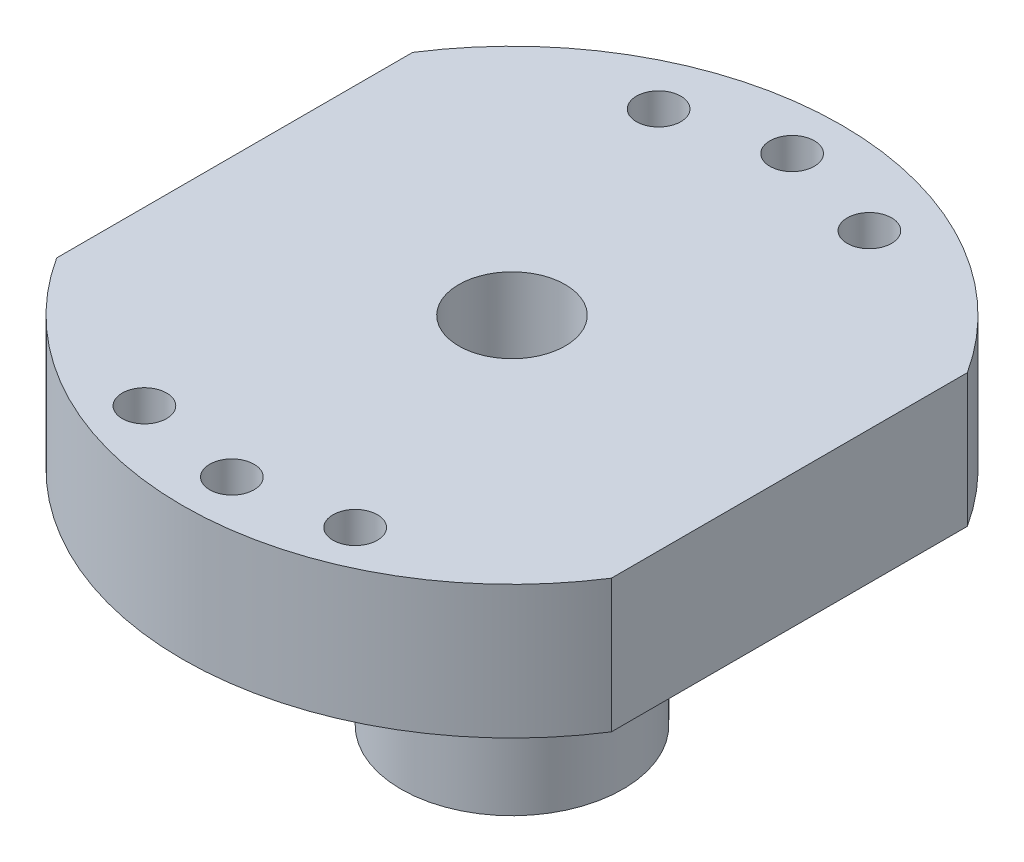
ISO-10303-21;
HEADER;
FILE_DESCRIPTION(('STEP AP214'),'2;1');
FILE_NAME('part.step','',(''),(''),'','','');
FILE_SCHEMA(('AUTOMOTIVE_DESIGN { 1 0 10303 214 1 1 1 1 }'));
ENDSEC;
DATA;
#1=APPLICATION_CONTEXT('core data for automotive mechanical design processes');
#2=APPLICATION_PROTOCOL_DEFINITION('international standard','automotive_design',2000,#1);
#3=PRODUCT_CONTEXT('',#1,'mechanical');
#4=PRODUCT('Part','Part','',(#3));
#5=PRODUCT_RELATED_PRODUCT_CATEGORY('part','',(#4));
#6=PRODUCT_DEFINITION_FORMATION('','',#4);
#7=PRODUCT_DEFINITION_CONTEXT('part definition',#1,'design');
#8=PRODUCT_DEFINITION('design','',#6,#7);
#9=PRODUCT_DEFINITION_SHAPE('','',#8);
#10=(LENGTH_UNIT() NAMED_UNIT(*) SI_UNIT(.MILLI.,.METRE.));
#11=(NAMED_UNIT(*) PLANE_ANGLE_UNIT() SI_UNIT($,.RADIAN.));
#12=(NAMED_UNIT(*) SI_UNIT($,.STERADIAN.) SOLID_ANGLE_UNIT());
#13=UNCERTAINTY_MEASURE_WITH_UNIT(LENGTH_MEASURE(1.E-05),#10,'distance_accuracy_value','');
#14=(GEOMETRIC_REPRESENTATION_CONTEXT(3) GLOBAL_UNCERTAINTY_ASSIGNED_CONTEXT((#13)) GLOBAL_UNIT_ASSIGNED_CONTEXT((#10,
#11,#12)) REPRESENTATION_CONTEXT('',''));
#15=CARTESIAN_POINT('',(0.,0.,0.));
#16=DIRECTION('',(0.,0.,1.));
#17=DIRECTION('',(1.,0.,0.));
#18=AXIS2_PLACEMENT_3D('',#15,#16,#17);
#19=CARTESIAN_POINT('',(26.5466575863252,-30.,-137.410786584764));
#20=DIRECTION('',(-1.,0.,0.));
#21=DIRECTION('',(0.,0.,1.));
#22=AXIS2_PLACEMENT_3D('',#19,#20,#21);
#23=PLANE('',#22);
#24=DIRECTION('',(0.,0.,1.));
#25=VECTOR('',#24,1.);
#26=CARTESIAN_POINT('',(26.5466575863252,-18.,-137.410786584764));
#27=LINE('',#26,#25);
#28=CARTESIAN_POINT('',(26.5466575863252,-18.,-53.7034146878907));
#29=VERTEX_POINT('',#28);
#30=CARTESIAN_POINT('',(26.5466575863252,-18.,-21.6168427301387));
#31=VERTEX_POINT('',#30);
#32=EDGE_CURVE('E119',#29,#31,#27,.T.);
#33=ORIENTED_EDGE('',*,*,#32,.T.);
#34=DIRECTION('',(0.,1.,0.));
#35=VECTOR('',#34,1.);
#36=CARTESIAN_POINT('',(26.5466575863252,-30.,-21.6168427301387));
#37=LINE('',#36,#35);
#38=CARTESIAN_POINT('',(26.5466575863252,-30.,-21.6168427301387));
#39=VERTEX_POINT('',#38);
#40=EDGE_CURVE('E93',#39,#31,#37,.T.);
#41=ORIENTED_EDGE('',*,*,#40,.F.);
#42=DIRECTION('',(0.,0.,1.));
#43=VECTOR('',#42,1.);
#44=CARTESIAN_POINT('',(26.5466575863252,-30.,-137.410786584764));
#45=LINE('',#44,#43);
#46=CARTESIAN_POINT('',(26.5466575863252,-30.,-53.7034146878907));
#47=VERTEX_POINT('',#46);
#48=EDGE_CURVE('E83',#47,#39,#45,.T.);
#49=ORIENTED_EDGE('',*,*,#48,.F.);
#50=DIRECTION('',(0.,1.,0.));
#51=VECTOR('',#50,1.);
#52=CARTESIAN_POINT('',(26.5466575863252,-30.,-53.7034146878907));
#53=LINE('',#52,#51);
#54=EDGE_CURVE('E97',#47,#29,#53,.T.);
#55=ORIENTED_EDGE('',*,*,#54,.T.);
#56=EDGE_LOOP('',(#33,#41,#49,#55));
#57=FACE_BOUND('',#56,.T.);
#58=ADVANCED_FACE('F34',(#57),#23,.F.);
#59=CARTESIAN_POINT('',(1.54665758632518,-30.,-37.6601287090147));
#60=DIRECTION('',(0.,1.,0.));
#61=DIRECTION('',(0.,0.,1.));
#62=AXIS2_PLACEMENT_3D('',#59,#60,#61);
#63=CYLINDRICAL_SURFACE('',#62,29.705);
#64=CARTESIAN_POINT('',(1.54665758632518,-18.,-37.6601287090147));
#65=DIRECTION('',(0.,-1.,0.));
#66=DIRECTION('',(0.,0.,-1.));
#67=AXIS2_PLACEMENT_3D('',#64,#65,#66);
#68=CIRCLE('',#67,29.705);
#69=CARTESIAN_POINT('',(-23.4533424136748,-18.,-21.6168427301387));
#70=VERTEX_POINT('',#69);
#71=EDGE_CURVE('E89',#31,#70,#68,.T.);
#72=ORIENTED_EDGE('',*,*,#71,.T.);
#73=DIRECTION('',(0.,1.,0.));
#74=VECTOR('',#73,1.);
#75=CARTESIAN_POINT('',(-23.4533424136748,-30.,-21.6168427301387));
#76=LINE('',#75,#74);
#77=CARTESIAN_POINT('',(-23.4533424136748,-30.,-21.6168427301387));
#78=VERTEX_POINT('',#77);
#79=EDGE_CURVE('E87',#78,#70,#76,.T.);
#80=ORIENTED_EDGE('',*,*,#79,.F.);
#81=CARTESIAN_POINT('',(1.54665758632518,-30.,-37.6601287090147));
#82=DIRECTION('',(0.,-1.,0.));
#83=DIRECTION('',(0.,0.,-1.));
#84=AXIS2_PLACEMENT_3D('',#81,#82,#83);
#85=CIRCLE('',#84,29.705);
#86=EDGE_CURVE('E78',#39,#78,#85,.T.);
#87=ORIENTED_EDGE('',*,*,#86,.F.);
#88=ORIENTED_EDGE('',*,*,#40,.T.);
#89=EDGE_LOOP('',(#72,#80,#87,#88));
#90=FACE_BOUND('',#89,.T.);
#91=ADVANCED_FACE('F88',(#90),#63,.T.);
#92=CARTESIAN_POINT('',(-23.4533424136748,-30.,-137.410786584764));
#93=DIRECTION('',(-1.,0.,0.));
#94=DIRECTION('',(0.,0.,1.));
#95=AXIS2_PLACEMENT_3D('',#92,#93,#94);
#96=PLANE('',#95);
#97=DIRECTION('',(0.,0.,1.));
#98=VECTOR('',#97,1.);
#99=CARTESIAN_POINT('',(-23.4533424136748,-18.,-137.410786584764));
#100=LINE('',#99,#98);
#101=CARTESIAN_POINT('',(-23.4533424136748,-18.,-53.7034146878907));
#102=VERTEX_POINT('',#101);
#103=EDGE_CURVE('E123',#102,#70,#100,.T.);
#104=ORIENTED_EDGE('',*,*,#103,.F.);
#105=DIRECTION('',(0.,1.,0.));
#106=VECTOR('',#105,1.);
#107=CARTESIAN_POINT('',(-23.4533424136748,-30.,-53.7034146878907));
#108=LINE('',#107,#106);
#109=CARTESIAN_POINT('',(-23.4533424136748,-30.,-53.7034146878907));
#110=VERTEX_POINT('',#109);
#111=EDGE_CURVE('E67',#110,#102,#108,.T.);
#112=ORIENTED_EDGE('',*,*,#111,.F.);
#113=DIRECTION('',(0.,0.,1.));
#114=VECTOR('',#113,1.);
#115=CARTESIAN_POINT('',(-23.4533424136748,-30.,-137.410786584764));
#116=LINE('',#115,#114);
#117=EDGE_CURVE('E81',#110,#78,#116,.T.);
#118=ORIENTED_EDGE('',*,*,#117,.T.);
#119=ORIENTED_EDGE('',*,*,#79,.T.);
#120=EDGE_LOOP('',(#104,#112,#118,#119));
#121=FACE_BOUND('',#120,.T.);
#122=ADVANCED_FACE('F95',(#121),#96,.T.);
#123=CARTESIAN_POINT('',(11.0466575863252,-30.,-14.0265658129032));
#124=DIRECTION('',(0.,1.,0.));
#125=DIRECTION('',(0.,0.,1.));
#126=AXIS2_PLACEMENT_3D('',#123,#124,#125);
#127=CYLINDRICAL_SURFACE('',#126,2.);
#128=CARTESIAN_POINT('',(11.0466575863252,-30.,-14.0265658129032));
#129=DIRECTION('',(0.,-1.,0.));
#130=DIRECTION('',(0.,0.,-1.));
#131=AXIS2_PLACEMENT_3D('',#128,#129,#130);
#132=CIRCLE('',#131,2.);
#133=CARTESIAN_POINT('',(11.0466575863252,-30.,-16.0265658129032));
#134=VERTEX_POINT('',#133);
#135=EDGE_CURVE('E204',#134,#134,#132,.F.);
#136=ORIENTED_EDGE('',*,*,#135,.F.);
#137=EDGE_LOOP('',(#136));
#138=FACE_BOUND('',#137,.T.);
#139=CARTESIAN_POINT('',(11.0466575863252,-18.,-14.0265658129032));
#140=DIRECTION('',(0.,-1.,0.));
#141=DIRECTION('',(0.,0.,-1.));
#142=AXIS2_PLACEMENT_3D('',#139,#140,#141);
#143=CIRCLE('',#142,2.);
#144=CARTESIAN_POINT('',(11.0466575863252,-18.,-16.0265658129032));
#145=VERTEX_POINT('',#144);
#146=EDGE_CURVE('E116',#145,#145,#143,.F.);
#147=ORIENTED_EDGE('',*,*,#146,.T.);
#148=EDGE_LOOP('',(#147));
#149=FACE_BOUND('',#148,.T.);
#150=ADVANCED_FACE('F156',(#138,#149),#127,.F.);
#151=CARTESIAN_POINT('',(-7.95334241367482,-30.,-60.3765658129032));
#152=DIRECTION('',(0.,1.,0.));
#153=DIRECTION('',(0.,0.,1.));
#154=AXIS2_PLACEMENT_3D('',#151,#152,#153);
#155=CYLINDRICAL_SURFACE('',#154,2.00000000000001);
#156=CARTESIAN_POINT('',(-7.95334241367482,-30.,-60.3765658129032));
#157=DIRECTION('',(0.,-1.,0.));
#158=DIRECTION('',(0.,0.,-1.));
#159=AXIS2_PLACEMENT_3D('',#156,#157,#158);
#160=CIRCLE('',#159,2.00000000000001);
#161=CARTESIAN_POINT('',(-7.95334241367482,-30.,-62.3765658129032));
#162=VERTEX_POINT('',#161);
#163=EDGE_CURVE('E206',#162,#162,#160,.F.);
#164=ORIENTED_EDGE('',*,*,#163,.F.);
#165=EDGE_LOOP('',(#164));
#166=FACE_BOUND('',#165,.T.);
#167=CARTESIAN_POINT('',(-7.95334241367482,-18.,-60.3765658129032));
#168=DIRECTION('',(0.,-1.,0.));
#169=DIRECTION('',(0.,0.,-1.));
#170=AXIS2_PLACEMENT_3D('',#167,#168,#169);
#171=CIRCLE('',#170,2.00000000000001);
#172=CARTESIAN_POINT('',(-7.95334241367482,-18.,-62.3765658129032));
#173=VERTEX_POINT('',#172);
#174=EDGE_CURVE('E113',#173,#173,#171,.F.);
#175=ORIENTED_EDGE('',*,*,#174,.T.);
#176=EDGE_LOOP('',(#175));
#177=FACE_BOUND('',#176,.T.);
#178=ADVANCED_FACE('F159',(#166,#177),#155,.F.);
#179=CARTESIAN_POINT('',(1.54665758632519,-30.,-12.4101287090147));
#180=DIRECTION('',(0.,1.,0.));
#181=DIRECTION('',(0.,0.,1.));
#182=AXIS2_PLACEMENT_3D('',#179,#180,#181);
#183=CYLINDRICAL_SURFACE('',#182,2.);
#184=CARTESIAN_POINT('',(1.54665758632519,-30.,-12.4101287090147));
#185=DIRECTION('',(0.,-1.,0.));
#186=DIRECTION('',(0.,0.,-1.));
#187=AXIS2_PLACEMENT_3D('',#184,#185,#186);
#188=CIRCLE('',#187,2.);
#189=CARTESIAN_POINT('',(1.54665758632519,-30.,-14.4101287090147));
#190=VERTEX_POINT('',#189);
#191=EDGE_CURVE('E211',#190,#190,#188,.F.);
#192=ORIENTED_EDGE('',*,*,#191,.F.);
#193=EDGE_LOOP('',(#192));
#194=FACE_BOUND('',#193,.T.);
#195=CARTESIAN_POINT('',(1.54665758632519,-18.,-12.4101287090147));
#196=DIRECTION('',(0.,-1.,0.));
#197=DIRECTION('',(0.,0.,-1.));
#198=AXIS2_PLACEMENT_3D('',#195,#196,#197);
#199=CIRCLE('',#198,2.);
#200=CARTESIAN_POINT('',(1.54665758632519,-18.,-14.4101287090147));
#201=VERTEX_POINT('',#200);
#202=EDGE_CURVE('E110',#201,#201,#199,.F.);
#203=ORIENTED_EDGE('',*,*,#202,.T.);
#204=EDGE_LOOP('',(#203));
#205=FACE_BOUND('',#204,.T.);
#206=ADVANCED_FACE('F163',(#194,#205),#183,.F.);
#207=CARTESIAN_POINT('',(1.54665758632519,-30.,-62.9101287090147));
#208=DIRECTION('',(0.,1.,0.));
#209=DIRECTION('',(0.,0.,1.));
#210=AXIS2_PLACEMENT_3D('',#207,#208,#209);
#211=CYLINDRICAL_SURFACE('',#210,2.);
#212=CARTESIAN_POINT('',(1.54665758632519,-30.,-62.9101287090147));
#213=DIRECTION('',(0.,-1.,0.));
#214=DIRECTION('',(0.,0.,-1.));
#215=AXIS2_PLACEMENT_3D('',#212,#213,#214);
#216=CIRCLE('',#215,2.);
#217=CARTESIAN_POINT('',(1.54665758632519,-30.,-64.9101287090147));
#218=VERTEX_POINT('',#217);
#219=EDGE_CURVE('E214',#218,#218,#216,.F.);
#220=ORIENTED_EDGE('',*,*,#219,.F.);
#221=EDGE_LOOP('',(#220));
#222=FACE_BOUND('',#221,.T.);
#223=CARTESIAN_POINT('',(1.54665758632519,-18.,-62.9101287090147));
#224=DIRECTION('',(0.,-1.,0.));
#225=DIRECTION('',(0.,0.,-1.));
#226=AXIS2_PLACEMENT_3D('',#223,#224,#225);
#227=CIRCLE('',#226,2.);
#228=CARTESIAN_POINT('',(1.54665758632519,-18.,-64.9101287090147));
#229=VERTEX_POINT('',#228);
#230=EDGE_CURVE('E107',#229,#229,#227,.F.);
#231=ORIENTED_EDGE('',*,*,#230,.T.);
#232=EDGE_LOOP('',(#231));
#233=FACE_BOUND('',#232,.T.);
#234=ADVANCED_FACE('F167',(#222,#233),#211,.F.);
#235=CARTESIAN_POINT('',(11.0466575863252,-30.,-60.3765658129032));
#236=DIRECTION('',(0.,1.,0.));
#237=DIRECTION('',(0.,0.,1.));
#238=AXIS2_PLACEMENT_3D('',#235,#236,#237);
#239=CYLINDRICAL_SURFACE('',#238,2.);
#240=CARTESIAN_POINT('',(11.0466575863252,-30.,-60.3765658129032));
#241=DIRECTION('',(0.,-1.,0.));
#242=DIRECTION('',(0.,0.,-1.));
#243=AXIS2_PLACEMENT_3D('',#240,#241,#242);
#244=CIRCLE('',#243,2.);
#245=CARTESIAN_POINT('',(11.0466575863252,-30.,-62.3765658129032));
#246=VERTEX_POINT('',#245);
#247=EDGE_CURVE('E217',#246,#246,#244,.F.);
#248=ORIENTED_EDGE('',*,*,#247,.F.);
#249=EDGE_LOOP('',(#248));
#250=FACE_BOUND('',#249,.T.);
#251=CARTESIAN_POINT('',(11.0466575863252,-18.,-60.3765658129032));
#252=DIRECTION('',(0.,-1.,0.));
#253=DIRECTION('',(0.,0.,-1.));
#254=AXIS2_PLACEMENT_3D('',#251,#252,#253);
#255=CIRCLE('',#254,2.);
#256=CARTESIAN_POINT('',(11.0466575863252,-18.,-62.3765658129032));
#257=VERTEX_POINT('',#256);
#258=EDGE_CURVE('E103',#257,#257,#255,.F.);
#259=ORIENTED_EDGE('',*,*,#258,.T.);
#260=EDGE_LOOP('',(#259));
#261=FACE_BOUND('',#260,.T.);
#262=ADVANCED_FACE('F171',(#250,#261),#239,.F.);
#263=CARTESIAN_POINT('',(-7.95334241367481,-30.,-14.0265658129032));
#264=DIRECTION('',(0.,1.,0.));
#265=DIRECTION('',(0.,0.,1.));
#266=AXIS2_PLACEMENT_3D('',#263,#264,#265);
#267=CYLINDRICAL_SURFACE('',#266,2.00000000000001);
#268=CARTESIAN_POINT('',(-7.95334241367481,-30.,-14.0265658129032));
#269=DIRECTION('',(0.,-1.,0.));
#270=DIRECTION('',(0.,0.,-1.));
#271=AXIS2_PLACEMENT_3D('',#268,#269,#270);
#272=CIRCLE('',#271,2.00000000000001);
#273=CARTESIAN_POINT('',(-7.95334241367481,-30.,-16.0265658129032));
#274=VERTEX_POINT('',#273);
#275=EDGE_CURVE('E184',#274,#274,#272,.F.);
#276=ORIENTED_EDGE('',*,*,#275,.F.);
#277=EDGE_LOOP('',(#276));
#278=FACE_BOUND('',#277,.T.);
#279=CARTESIAN_POINT('',(-7.95334241367481,-18.,-14.0265658129032));
#280=DIRECTION('',(0.,-1.,0.));
#281=DIRECTION('',(0.,0.,-1.));
#282=AXIS2_PLACEMENT_3D('',#279,#280,#281);
#283=CIRCLE('',#282,2.00000000000001);
#284=CARTESIAN_POINT('',(-7.95334241367481,-18.,-16.0265658129032));
#285=VERTEX_POINT('',#284);
#286=EDGE_CURVE('E100',#285,#285,#283,.F.);
#287=ORIENTED_EDGE('',*,*,#286,.T.);
#288=EDGE_LOOP('',(#287));
#289=FACE_BOUND('',#288,.T.);
#290=ADVANCED_FACE('F174',(#278,#289),#267,.F.);
#291=EDGE_CURVE('E70',#102,#29,#68,.T.);
#292=ORIENTED_EDGE('',*,*,#291,.T.);
#293=ORIENTED_EDGE('',*,*,#54,.F.);
#294=EDGE_CURVE('E51',#110,#47,#85,.T.);
#295=ORIENTED_EDGE('',*,*,#294,.F.);
#296=ORIENTED_EDGE('',*,*,#111,.T.);
#297=EDGE_LOOP('',(#292,#293,#295,#296));
#298=FACE_BOUND('',#297,.T.);
#299=ADVANCED_FACE('F153',(#298),#63,.T.);
#300=CARTESIAN_POINT('',(1.54665758632519,-30.,-137.410786584764));
#301=DIRECTION('',(0.,-1.,0.));
#302=DIRECTION('',(0.,0.,-1.));
#303=AXIS2_PLACEMENT_3D('',#300,#301,#302);
#304=PLANE('',#303);
#305=CARTESIAN_POINT('',(1.54665758632518,-30.,-37.6601287090147));
#306=DIRECTION('',(0.,-1.,0.));
#307=DIRECTION('',(0.,0.,-1.));
#308=AXIS2_PLACEMENT_3D('',#305,#306,#307);
#309=CIRCLE('',#308,10.);
#310=CARTESIAN_POINT('',(1.54665758632518,-30.,-47.6601287090147));
#311=VERTEX_POINT('',#310);
#312=EDGE_CURVE('E128',#311,#311,#309,.T.);
#313=ORIENTED_EDGE('',*,*,#312,.F.);
#314=EDGE_LOOP('',(#313));
#315=FACE_BOUND('',#314,.T.);
#316=ORIENTED_EDGE('',*,*,#275,.T.);
#317=EDGE_LOOP('',(#316));
#318=FACE_BOUND('',#317,.T.);
#319=ORIENTED_EDGE('',*,*,#247,.T.);
#320=EDGE_LOOP('',(#319));
#321=FACE_BOUND('',#320,.T.);
#322=ORIENTED_EDGE('',*,*,#219,.T.);
#323=EDGE_LOOP('',(#322));
#324=FACE_BOUND('',#323,.T.);
#325=ORIENTED_EDGE('',*,*,#191,.T.);
#326=EDGE_LOOP('',(#325));
#327=FACE_BOUND('',#326,.T.);
#328=ORIENTED_EDGE('',*,*,#163,.T.);
#329=EDGE_LOOP('',(#328));
#330=FACE_BOUND('',#329,.T.);
#331=ORIENTED_EDGE('',*,*,#135,.T.);
#332=EDGE_LOOP('',(#331));
#333=FACE_BOUND('',#332,.T.);
#334=ORIENTED_EDGE('',*,*,#48,.T.);
#335=ORIENTED_EDGE('',*,*,#86,.T.);
#336=ORIENTED_EDGE('',*,*,#117,.F.);
#337=ORIENTED_EDGE('',*,*,#294,.T.);
#338=EDGE_LOOP('',(#334,#335,#336,#337));
#339=FACE_BOUND('',#338,.T.);
#340=ADVANCED_FACE('F79',(#315,#318,#321,#324,#327,#330,#333,#339),#304,.T.);
#341=CARTESIAN_POINT('',(1.54665758632519,-18.,-137.410786584764));
#342=DIRECTION('',(0.,-1.,0.));
#343=DIRECTION('',(0.,0.,-1.));
#344=AXIS2_PLACEMENT_3D('',#341,#342,#343);
#345=PLANE('',#344);
#346=CARTESIAN_POINT('',(1.54665758632518,-18.,-37.6601287090147));
#347=DIRECTION('',(0.,-1.,0.));
#348=DIRECTION('',(0.,0.,-1.));
#349=AXIS2_PLACEMENT_3D('',#346,#347,#348);
#350=CIRCLE('',#349,4.8);
#351=CARTESIAN_POINT('',(1.54665758632518,-18.,-42.4601287090147));
#352=VERTEX_POINT('',#351);
#353=EDGE_CURVE('E104',#352,#352,#350,.T.);
#354=ORIENTED_EDGE('',*,*,#353,.T.);
#355=EDGE_LOOP('',(#354));
#356=FACE_BOUND('',#355,.T.);
#357=ORIENTED_EDGE('',*,*,#286,.F.);
#358=EDGE_LOOP('',(#357));
#359=FACE_BOUND('',#358,.T.);
#360=ORIENTED_EDGE('',*,*,#258,.F.);
#361=EDGE_LOOP('',(#360));
#362=FACE_BOUND('',#361,.T.);
#363=ORIENTED_EDGE('',*,*,#230,.F.);
#364=EDGE_LOOP('',(#363));
#365=FACE_BOUND('',#364,.T.);
#366=ORIENTED_EDGE('',*,*,#202,.F.);
#367=EDGE_LOOP('',(#366));
#368=FACE_BOUND('',#367,.T.);
#369=ORIENTED_EDGE('',*,*,#174,.F.);
#370=EDGE_LOOP('',(#369));
#371=FACE_BOUND('',#370,.T.);
#372=ORIENTED_EDGE('',*,*,#146,.F.);
#373=EDGE_LOOP('',(#372));
#374=FACE_BOUND('',#373,.T.);
#375=ORIENTED_EDGE('',*,*,#32,.F.);
#376=ORIENTED_EDGE('',*,*,#291,.F.);
#377=ORIENTED_EDGE('',*,*,#103,.T.);
#378=ORIENTED_EDGE('',*,*,#71,.F.);
#379=EDGE_LOOP('',(#375,#376,#377,#378));
#380=FACE_BOUND('',#379,.T.);
#381=ADVANCED_FACE('F187',(#356,#359,#362,#365,#368,#371,#374,#380),#345,.F.);
#382=CARTESIAN_POINT('',(1.54665758632518,-18.,-37.6601287090147));
#383=DIRECTION('',(0.,-1.,0.));
#384=DIRECTION('',(0.,0.,-1.));
#385=AXIS2_PLACEMENT_3D('',#382,#383,#384);
#386=CYLINDRICAL_SURFACE('',#385,4.8);
#387=ORIENTED_EDGE('',*,*,#353,.F.);
#388=EDGE_LOOP('',(#387));
#389=FACE_BOUND('',#388,.T.);
#390=CARTESIAN_POINT('',(1.54665758632518,-45.,-37.6601287090147));
#391=DIRECTION('',(0.,1.,0.));
#392=DIRECTION('',(0.,0.,1.));
#393=AXIS2_PLACEMENT_3D('',#390,#391,#392);
#394=CIRCLE('',#393,4.8);
#395=CARTESIAN_POINT('',(1.54665758632518,-45.,-32.8601287090147));
#396=VERTEX_POINT('',#395);
#397=EDGE_CURVE('E226',#396,#396,#394,.T.);
#398=ORIENTED_EDGE('',*,*,#397,.F.);
#399=EDGE_LOOP('',(#398));
#400=FACE_BOUND('',#399,.T.);
#401=ADVANCED_FACE('F190',(#389,#400),#386,.F.);
#402=CARTESIAN_POINT('',(1.5466575863252,-50.,-33.1601287090147));
#403=DIRECTION('',(0.,-1.,0.));
#404=DIRECTION('',(0.,0.,-1.));
#405=AXIS2_PLACEMENT_3D('',#402,#403,#404);
#406=PLANE('',#405);
#407=CARTESIAN_POINT('',(1.54665758632518,-50.,-37.6601287090147));
#408=DIRECTION('',(0.,-1.,0.));
#409=DIRECTION('',(0.,0.,-1.));
#410=AXIS2_PLACEMENT_3D('',#407,#408,#409);
#411=CIRCLE('',#410,5.50000000000002);
#412=CARTESIAN_POINT('',(1.54665758632518,-50.,-43.1601287090147));
#413=VERTEX_POINT('',#412);
#414=EDGE_CURVE('E43',#413,#413,#411,.F.);
#415=ORIENTED_EDGE('',*,*,#414,.T.);
#416=EDGE_LOOP('',(#415));
#417=FACE_BOUND('',#416,.T.);
#418=CARTESIAN_POINT('',(1.54665758632518,-50.,-37.6601287090147));
#419=DIRECTION('',(0.,1.,0.));
#420=DIRECTION('',(0.,0.,1.));
#421=AXIS2_PLACEMENT_3D('',#418,#419,#420);
#422=CIRCLE('',#421,10.);
#423=CARTESIAN_POINT('',(1.54665758632518,-50.,-27.6601287090147));
#424=VERTEX_POINT('',#423);
#425=EDGE_CURVE('E223',#424,#424,#422,.T.);
#426=ORIENTED_EDGE('',*,*,#425,.F.);
#427=EDGE_LOOP('',(#426));
#428=FACE_BOUND('',#427,.T.);
#429=ADVANCED_FACE('F133',(#417,#428),#406,.T.);
#430=CARTESIAN_POINT('',(1.54665758632518,-30.,-37.6601287090147));
#431=DIRECTION('',(0.,1.,0.));
#432=DIRECTION('',(0.,0.,1.));
#433=AXIS2_PLACEMENT_3D('',#430,#431,#432);
#434=CYLINDRICAL_SURFACE('',#433,10.);
#435=ORIENTED_EDGE('',*,*,#425,.T.);
#436=EDGE_LOOP('',(#435));
#437=FACE_BOUND('',#436,.T.);
#438=ORIENTED_EDGE('',*,*,#312,.T.);
#439=EDGE_LOOP('',(#438));
#440=FACE_BOUND('',#439,.T.);
#441=ADVANCED_FACE('F235',(#437,#440),#434,.T.);
#442=CARTESIAN_POINT('',(1.5466575863252,-45.,-32.8601287090147));
#443=DIRECTION('',(0.,1.,0.));
#444=DIRECTION('',(0.,0.,1.));
#445=AXIS2_PLACEMENT_3D('',#442,#443,#444);
#446=PLANE('',#445);
#447=ORIENTED_EDGE('',*,*,#397,.T.);
#448=EDGE_LOOP('',(#447));
#449=FACE_BOUND('',#448,.T.);
#450=CARTESIAN_POINT('',(1.54665758632518,-45.,-37.6601287090147));
#451=DIRECTION('',(0.,1.,0.));
#452=DIRECTION('',(0.,0.,1.));
#453=AXIS2_PLACEMENT_3D('',#450,#451,#452);
#454=CIRCLE('',#453,4.5);
#455=CARTESIAN_POINT('',(1.54665758632518,-45.,-33.1601287090147));
#456=VERTEX_POINT('',#455);
#457=EDGE_CURVE('E229',#456,#456,#454,.T.);
#458=ORIENTED_EDGE('',*,*,#457,.F.);
#459=EDGE_LOOP('',(#458));
#460=FACE_BOUND('',#459,.T.);
#461=ADVANCED_FACE('F142',(#449,#460),#446,.T.);
#462=CARTESIAN_POINT('',(1.54665758632518,-30.,-37.6601287090147));
#463=DIRECTION('',(0.,1.,0.));
#464=DIRECTION('',(0.,0.,1.));
#465=AXIS2_PLACEMENT_3D('',#462,#463,#464);
#466=CYLINDRICAL_SURFACE('',#465,4.5);
#467=CARTESIAN_POINT('',(1.54665758632518,-49.,-37.6601287090147));
#468=DIRECTION('',(0.,-1.,0.));
#469=DIRECTION('',(0.,0.,-1.));
#470=AXIS2_PLACEMENT_3D('',#467,#468,#469);
#471=CIRCLE('',#470,4.5);
#472=CARTESIAN_POINT('',(1.54665758632518,-49.,-42.1601287090147));
#473=VERTEX_POINT('',#472);
#474=EDGE_CURVE('E11',#473,#473,#471,.T.);
#475=ORIENTED_EDGE('',*,*,#474,.T.);
#476=EDGE_LOOP('',(#475));
#477=FACE_BOUND('',#476,.T.);
#478=ORIENTED_EDGE('',*,*,#457,.T.);
#479=EDGE_LOOP('',(#478));
#480=FACE_BOUND('',#479,.T.);
#481=ADVANCED_FACE('F137',(#477,#480),#466,.F.);
#482=CARTESIAN_POINT('',(1.54665758632518,-50.,-37.6601287090147));
#483=DIRECTION('',(0.,-1.,0.));
#484=DIRECTION('',(0.,0.,-1.));
#485=AXIS2_PLACEMENT_3D('',#482,#483,#484);
#486=CONICAL_SURFACE('',#485,5.50000000000002,0.785398163397448);
#487=ORIENTED_EDGE('',*,*,#474,.F.);
#488=EDGE_LOOP('',(#487));
#489=FACE_BOUND('',#488,.T.);
#490=ORIENTED_EDGE('',*,*,#414,.F.);
#491=EDGE_LOOP('',(#490));
#492=FACE_BOUND('',#491,.T.);
#493=ADVANCED_FACE('F36',(#489,#492),#486,.F.);
#494=CLOSED_SHELL('',(#58,#91,#122,#150,#178,#206,#234,#262,#290,#299,#340,#381,#401,#429,#441,
#461,#481,#493));
#495=MANIFOLD_SOLID_BREP('B2',#494);
#496=ADVANCED_BREP_SHAPE_REPRESENTATION('',(#18,#495),#14);
#497=SHAPE_DEFINITION_REPRESENTATION(#9,#496);
ENDSEC;
END-ISO-10303-21;
